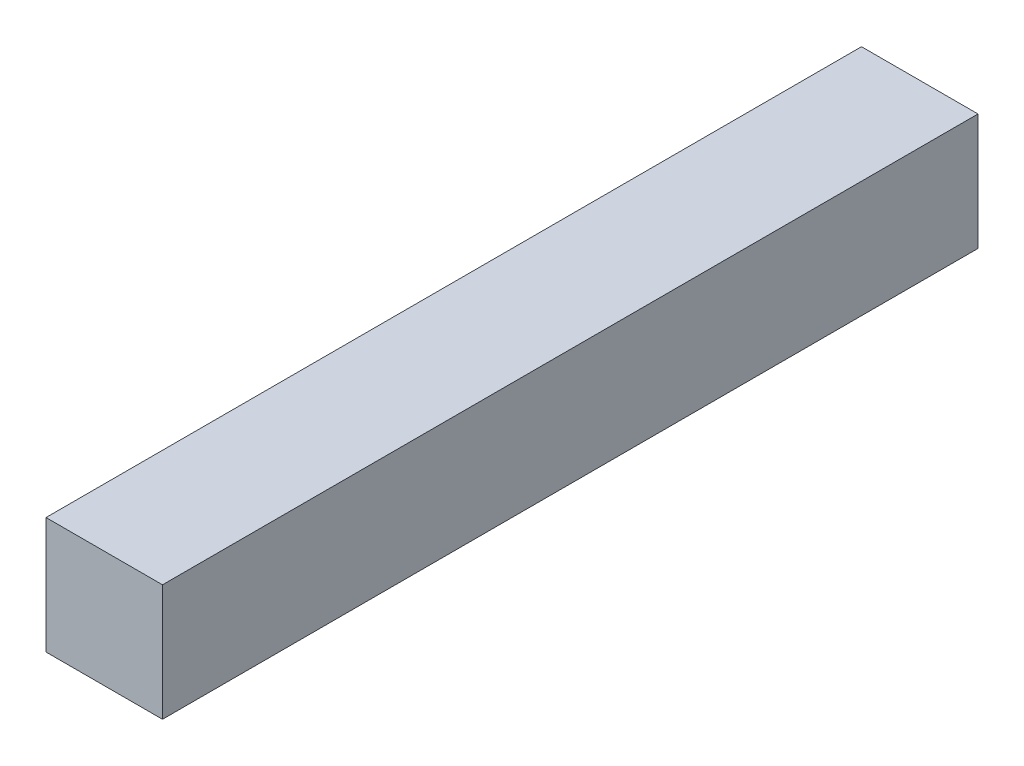
ISO-10303-21;
HEADER;
FILE_DESCRIPTION(('STEP AP214'),'2;1');
FILE_NAME('part.step','',(''),(''),'','','');
FILE_SCHEMA(('AUTOMOTIVE_DESIGN { 1 0 10303 214 1 1 1 1 }'));
ENDSEC;
DATA;
#1=APPLICATION_CONTEXT('core data for automotive mechanical design processes');
#2=APPLICATION_PROTOCOL_DEFINITION('international standard','automotive_design',2000,#1);
#3=PRODUCT_CONTEXT('',#1,'mechanical');
#4=PRODUCT('Part','Part','',(#3));
#5=PRODUCT_RELATED_PRODUCT_CATEGORY('part','',(#4));
#6=PRODUCT_DEFINITION_FORMATION('','',#4);
#7=PRODUCT_DEFINITION_CONTEXT('part definition',#1,'design');
#8=PRODUCT_DEFINITION('design','',#6,#7);
#9=PRODUCT_DEFINITION_SHAPE('','',#8);
#10=(LENGTH_UNIT() NAMED_UNIT(*) SI_UNIT(.MILLI.,.METRE.));
#11=(NAMED_UNIT(*) PLANE_ANGLE_UNIT() SI_UNIT($,.RADIAN.));
#12=(NAMED_UNIT(*) SI_UNIT($,.STERADIAN.) SOLID_ANGLE_UNIT());
#13=UNCERTAINTY_MEASURE_WITH_UNIT(LENGTH_MEASURE(1.E-05),#10,'distance_accuracy_value','');
#14=(GEOMETRIC_REPRESENTATION_CONTEXT(3) GLOBAL_UNCERTAINTY_ASSIGNED_CONTEXT((#13)) GLOBAL_UNIT_ASSIGNED_CONTEXT((#10,
#11,#12)) REPRESENTATION_CONTEXT('',''));
#15=CARTESIAN_POINT('',(0.,0.,0.));
#16=DIRECTION('',(0.,0.,1.));
#17=DIRECTION('',(1.,0.,0.));
#18=AXIS2_PLACEMENT_3D('',#15,#16,#17);
#19=CARTESIAN_POINT('',(0.,0.,70.));
#20=DIRECTION('',(1.,0.,0.));
#21=DIRECTION('',(0.,1.,0.));
#22=AXIS2_PLACEMENT_3D('',#19,#20,#21);
#23=PLANE('',#22);
#24=DIRECTION('',(0.,-1.,0.));
#25=VECTOR('',#24,1.);
#26=CARTESIAN_POINT('',(0.,0.,0.));
#27=LINE('',#26,#25);
#28=CARTESIAN_POINT('',(0.,10.,0.));
#29=VERTEX_POINT('',#28);
#30=CARTESIAN_POINT('',(0.,0.,0.));
#31=VERTEX_POINT('',#30);
#32=EDGE_CURVE('E96',#29,#31,#27,.T.);
#33=ORIENTED_EDGE('',*,*,#32,.T.);
#34=DIRECTION('',(0.,0.,-1.));
#35=VECTOR('',#34,1.);
#36=CARTESIAN_POINT('',(0.,0.,70.));
#37=LINE('',#36,#35);
#38=CARTESIAN_POINT('',(0.,0.,70.));
#39=VERTEX_POINT('',#38);
#40=EDGE_CURVE('E11',#39,#31,#37,.T.);
#41=ORIENTED_EDGE('',*,*,#40,.F.);
#42=DIRECTION('',(0.,-1.,0.));
#43=VECTOR('',#42,1.);
#44=CARTESIAN_POINT('',(0.,0.,70.));
#45=LINE('',#44,#43);
#46=CARTESIAN_POINT('',(0.,10.,70.));
#47=VERTEX_POINT('',#46);
#48=EDGE_CURVE('E84',#47,#39,#45,.T.);
#49=ORIENTED_EDGE('',*,*,#48,.F.);
#50=DIRECTION('',(0.,0.,-1.));
#51=VECTOR('',#50,1.);
#52=CARTESIAN_POINT('',(0.,10.,70.));
#53=LINE('',#52,#51);
#54=EDGE_CURVE('E92',#47,#29,#53,.T.);
#55=ORIENTED_EDGE('',*,*,#54,.T.);
#56=EDGE_LOOP('',(#33,#41,#49,#55));
#57=FACE_BOUND('',#56,.T.);
#58=ADVANCED_FACE('F33',(#57),#23,.F.);
#59=CARTESIAN_POINT('',(0.,0.,70.));
#60=DIRECTION('',(0.,1.,0.));
#61=DIRECTION('',(0.,0.,1.));
#62=AXIS2_PLACEMENT_3D('',#59,#60,#61);
#63=PLANE('',#62);
#64=DIRECTION('',(1.,0.,0.));
#65=VECTOR('',#64,1.);
#66=CARTESIAN_POINT('',(0.,0.,0.));
#67=LINE('',#66,#65);
#68=CARTESIAN_POINT('',(10.,0.,0.));
#69=VERTEX_POINT('',#68);
#70=EDGE_CURVE('E88',#31,#69,#67,.T.);
#71=ORIENTED_EDGE('',*,*,#70,.T.);
#72=DIRECTION('',(0.,0.,-1.));
#73=VECTOR('',#72,1.);
#74=CARTESIAN_POINT('',(10.,0.,70.));
#75=LINE('',#74,#73);
#76=CARTESIAN_POINT('',(10.,0.,70.));
#77=VERTEX_POINT('',#76);
#78=EDGE_CURVE('E41',#77,#69,#75,.T.);
#79=ORIENTED_EDGE('',*,*,#78,.F.);
#80=DIRECTION('',(1.,0.,0.));
#81=VECTOR('',#80,1.);
#82=CARTESIAN_POINT('',(0.,0.,70.));
#83=LINE('',#82,#81);
#84=EDGE_CURVE('E79',#39,#77,#83,.T.);
#85=ORIENTED_EDGE('',*,*,#84,.F.);
#86=ORIENTED_EDGE('',*,*,#40,.T.);
#87=EDGE_LOOP('',(#71,#79,#85,#86));
#88=FACE_BOUND('',#87,.T.);
#89=ADVANCED_FACE('F87',(#88),#63,.F.);
#90=CARTESIAN_POINT('',(10.,0.,70.));
#91=DIRECTION('',(-1.,0.,0.));
#92=DIRECTION('',(0.,-1.,0.));
#93=AXIS2_PLACEMENT_3D('',#90,#91,#92);
#94=PLANE('',#93);
#95=DIRECTION('',(0.,1.,0.));
#96=VECTOR('',#95,1.);
#97=CARTESIAN_POINT('',(10.,0.,0.));
#98=LINE('',#97,#96);
#99=CARTESIAN_POINT('',(9.99999999999999,10.,0.));
#100=VERTEX_POINT('',#99);
#101=EDGE_CURVE('E66',#69,#100,#98,.T.);
#102=ORIENTED_EDGE('',*,*,#101,.T.);
#103=DIRECTION('',(0.,0.,-1.));
#104=VECTOR('',#103,1.);
#105=CARTESIAN_POINT('',(9.99999999999999,10.,70.));
#106=LINE('',#105,#104);
#107=CARTESIAN_POINT('',(9.99999999999999,10.,70.));
#108=VERTEX_POINT('',#107);
#109=EDGE_CURVE('E89',#108,#100,#106,.T.);
#110=ORIENTED_EDGE('',*,*,#109,.F.);
#111=DIRECTION('',(0.,1.,0.));
#112=VECTOR('',#111,1.);
#113=CARTESIAN_POINT('',(10.,0.,70.));
#114=LINE('',#113,#112);
#115=EDGE_CURVE('E82',#77,#108,#114,.T.);
#116=ORIENTED_EDGE('',*,*,#115,.F.);
#117=ORIENTED_EDGE('',*,*,#78,.T.);
#118=EDGE_LOOP('',(#102,#110,#116,#117));
#119=FACE_BOUND('',#118,.T.);
#120=ADVANCED_FACE('F90',(#119),#94,.F.);
#121=CARTESIAN_POINT('',(0.,10.,70.));
#122=DIRECTION('',(0.,-1.,0.));
#123=DIRECTION('',(0.,0.,-1.));
#124=AXIS2_PLACEMENT_3D('',#121,#122,#123);
#125=PLANE('',#124);
#126=DIRECTION('',(-1.,0.,0.));
#127=VECTOR('',#126,1.);
#128=CARTESIAN_POINT('',(0.,10.,0.));
#129=LINE('',#128,#127);
#130=EDGE_CURVE('E72',#100,#29,#129,.T.);
#131=ORIENTED_EDGE('',*,*,#130,.T.);
#132=ORIENTED_EDGE('',*,*,#54,.F.);
#133=DIRECTION('',(-1.,0.,0.));
#134=VECTOR('',#133,1.);
#135=CARTESIAN_POINT('',(0.,10.,70.));
#136=LINE('',#135,#134);
#137=EDGE_CURVE('E49',#108,#47,#136,.T.);
#138=ORIENTED_EDGE('',*,*,#137,.F.);
#139=ORIENTED_EDGE('',*,*,#109,.T.);
#140=EDGE_LOOP('',(#131,#132,#138,#139));
#141=FACE_BOUND('',#140,.T.);
#142=ADVANCED_FACE('F103',(#141),#125,.F.);
#143=CARTESIAN_POINT('',(0.,0.,70.));
#144=DIRECTION('',(0.,0.,-1.));
#145=DIRECTION('',(-1.,0.,0.));
#146=AXIS2_PLACEMENT_3D('',#143,#144,#145);
#147=PLANE('',#146);
#148=ORIENTED_EDGE('',*,*,#48,.T.);
#149=ORIENTED_EDGE('',*,*,#84,.T.);
#150=ORIENTED_EDGE('',*,*,#115,.T.);
#151=ORIENTED_EDGE('',*,*,#137,.T.);
#152=EDGE_LOOP('',(#148,#149,#150,#151));
#153=FACE_BOUND('',#152,.T.);
#154=ADVANCED_FACE('F80',(#153),#147,.F.);
#155=CARTESIAN_POINT('',(0.,0.,0.));
#156=DIRECTION('',(0.,0.,-1.));
#157=DIRECTION('',(-1.,0.,0.));
#158=AXIS2_PLACEMENT_3D('',#155,#156,#157);
#159=PLANE('',#158);
#160=ORIENTED_EDGE('',*,*,#32,.F.);
#161=ORIENTED_EDGE('',*,*,#130,.F.);
#162=ORIENTED_EDGE('',*,*,#101,.F.);
#163=ORIENTED_EDGE('',*,*,#70,.F.);
#164=EDGE_LOOP('',(#160,#161,#162,#163));
#165=FACE_BOUND('',#164,.T.);
#166=ADVANCED_FACE('F106',(#165),#159,.T.);
#167=CLOSED_SHELL('',(#58,#89,#120,#142,#154,#166));
#168=MANIFOLD_SOLID_BREP('B2',#167);
#169=ADVANCED_BREP_SHAPE_REPRESENTATION('',(#18,#168),#14);
#170=SHAPE_DEFINITION_REPRESENTATION(#9,#169);
ENDSEC;
END-ISO-10303-21;
